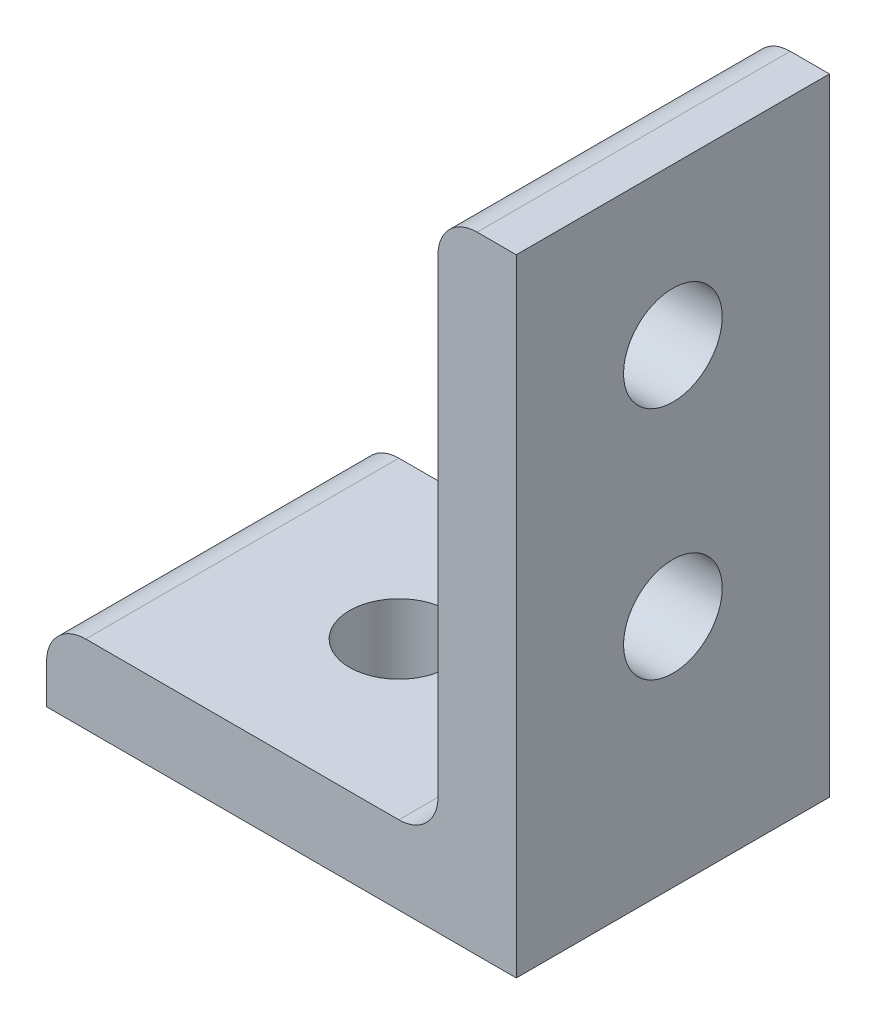
ISO-10303-21;
HEADER;
FILE_DESCRIPTION(('STEP AP214'),'2;1');
FILE_NAME('part.step','',(''),(''),'','','');
FILE_SCHEMA(('AUTOMOTIVE_DESIGN { 1 0 10303 214 1 1 1 1 }'));
ENDSEC;
DATA;
#1=APPLICATION_CONTEXT('core data for automotive mechanical design processes');
#2=APPLICATION_PROTOCOL_DEFINITION('international standard','automotive_design',2000,#1);
#3=PRODUCT_CONTEXT('',#1,'mechanical');
#4=PRODUCT('Part','Part','',(#3));
#5=PRODUCT_RELATED_PRODUCT_CATEGORY('part','',(#4));
#6=PRODUCT_DEFINITION_FORMATION('','',#4);
#7=PRODUCT_DEFINITION_CONTEXT('part definition',#1,'design');
#8=PRODUCT_DEFINITION('design','',#6,#7);
#9=PRODUCT_DEFINITION_SHAPE('','',#8);
#10=(LENGTH_UNIT() NAMED_UNIT(*) SI_UNIT(.MILLI.,.METRE.));
#11=(NAMED_UNIT(*) PLANE_ANGLE_UNIT() SI_UNIT($,.RADIAN.));
#12=(NAMED_UNIT(*) SI_UNIT($,.STERADIAN.) SOLID_ANGLE_UNIT());
#13=UNCERTAINTY_MEASURE_WITH_UNIT(LENGTH_MEASURE(1.E-05),#10,'distance_accuracy_value','');
#14=(GEOMETRIC_REPRESENTATION_CONTEXT(3) GLOBAL_UNCERTAINTY_ASSIGNED_CONTEXT((#13)) GLOBAL_UNIT_ASSIGNED_CONTEXT((#10,
#11,#12)) REPRESENTATION_CONTEXT('',''));
#15=CARTESIAN_POINT('',(0.,0.,0.));
#16=DIRECTION('',(0.,0.,1.));
#17=DIRECTION('',(1.,0.,0.));
#18=AXIS2_PLACEMENT_3D('',#15,#16,#17);
#19=CARTESIAN_POINT('',(-19.05,3.175,12.7));
#20=DIRECTION('',(1.,0.,0.));
#21=DIRECTION('',(0.,0.,-1.));
#22=AXIS2_PLACEMENT_3D('',#19,#20,#21);
#23=PLANE('',#22);
#24=DIRECTION('',(0.,-1.,0.));
#25=VECTOR('',#24,1.);
#26=CARTESIAN_POINT('',(-19.05,3.175,-12.7));
#27=LINE('',#26,#25);
#28=CARTESIAN_POINT('',(-19.05,3.175,-12.7));
#29=VERTEX_POINT('',#28);
#30=CARTESIAN_POINT('',(-19.05,0.,-12.7));
#31=VERTEX_POINT('',#30);
#32=EDGE_CURVE('E138',#29,#31,#27,.T.);
#33=ORIENTED_EDGE('',*,*,#32,.T.);
#34=DIRECTION('',(0.,0.,-1.));
#35=VECTOR('',#34,1.);
#36=CARTESIAN_POINT('',(-19.05,0.,12.7));
#37=LINE('',#36,#35);
#38=CARTESIAN_POINT('',(-19.05,0.,12.7));
#39=VERTEX_POINT('',#38);
#40=EDGE_CURVE('E11',#39,#31,#37,.T.);
#41=ORIENTED_EDGE('',*,*,#40,.F.);
#42=DIRECTION('',(0.,-1.,0.));
#43=VECTOR('',#42,1.);
#44=CARTESIAN_POINT('',(-19.05,3.175,12.7));
#45=LINE('',#44,#43);
#46=CARTESIAN_POINT('',(-19.05,3.175,12.7));
#47=VERTEX_POINT('',#46);
#48=EDGE_CURVE('E155',#47,#39,#45,.T.);
#49=ORIENTED_EDGE('',*,*,#48,.F.);
#50=DIRECTION('',(0.,0.,-1.));
#51=VECTOR('',#50,1.);
#52=CARTESIAN_POINT('',(-19.05,3.175,12.7));
#53=LINE('',#52,#51);
#54=EDGE_CURVE('E134',#47,#29,#53,.T.);
#55=ORIENTED_EDGE('',*,*,#54,.T.);
#56=EDGE_LOOP('',(#33,#41,#49,#55));
#57=FACE_BOUND('',#56,.T.);
#58=ADVANCED_FACE('F36',(#57),#23,.F.);
#59=CARTESIAN_POINT('',(-19.05,0.,12.7));
#60=DIRECTION('',(0.,1.,0.));
#61=DIRECTION('',(0.,0.,1.));
#62=AXIS2_PLACEMENT_3D('',#59,#60,#61);
#63=PLANE('',#62);
#64=CARTESIAN_POINT('',(-3.175,0.,0.));
#65=DIRECTION('',(0.,1.,0.));
#66=DIRECTION('',(-1.,0.,0.));
#67=AXIS2_PLACEMENT_3D('',#64,#65,#66);
#68=CIRCLE('',#67,4.);
#69=CARTESIAN_POINT('',(-7.175,0.,0.));
#70=VERTEX_POINT('',#69);
#71=EDGE_CURVE('E142',#70,#70,#68,.T.);
#72=ORIENTED_EDGE('',*,*,#71,.T.);
#73=EDGE_LOOP('',(#72));
#74=FACE_BOUND('',#73,.T.);
#75=DIRECTION('',(1.,0.,0.));
#76=VECTOR('',#75,1.);
#77=CARTESIAN_POINT('',(-19.05,0.,-12.7));
#78=LINE('',#77,#76);
#79=CARTESIAN_POINT('',(19.05,0.,-12.7));
#80=VERTEX_POINT('',#79);
#81=EDGE_CURVE('E141',#31,#80,#78,.T.);
#82=ORIENTED_EDGE('',*,*,#81,.T.);
#83=DIRECTION('',(0.,0.,-1.));
#84=VECTOR('',#83,1.);
#85=CARTESIAN_POINT('',(19.05,0.,12.7));
#86=LINE('',#85,#84);
#87=CARTESIAN_POINT('',(19.05,0.,12.7));
#88=VERTEX_POINT('',#87);
#89=EDGE_CURVE('E44',#88,#80,#86,.T.);
#90=ORIENTED_EDGE('',*,*,#89,.F.);
#91=DIRECTION('',(1.,0.,0.));
#92=VECTOR('',#91,1.);
#93=CARTESIAN_POINT('',(-19.05,0.,12.7));
#94=LINE('',#93,#92);
#95=EDGE_CURVE('E98',#39,#88,#94,.T.);
#96=ORIENTED_EDGE('',*,*,#95,.F.);
#97=ORIENTED_EDGE('',*,*,#40,.T.);
#98=EDGE_LOOP('',(#82,#90,#96,#97));
#99=FACE_BOUND('',#98,.T.);
#100=ADVANCED_FACE('F244',(#74,#99),#63,.F.);
#101=CARTESIAN_POINT('',(19.05,0.,12.7));
#102=DIRECTION('',(-1.,0.,0.));
#103=DIRECTION('',(0.,0.,1.));
#104=AXIS2_PLACEMENT_3D('',#101,#102,#103);
#105=PLANE('',#104);
#106=CARTESIAN_POINT('',(19.05,38.1,0.));
#107=DIRECTION('',(-1.,0.,0.));
#108=DIRECTION('',(0.,-1.,0.));
#109=AXIS2_PLACEMENT_3D('',#106,#107,#108);
#110=CIRCLE('',#109,4.);
#111=CARTESIAN_POINT('',(19.05,34.1,0.));
#112=VERTEX_POINT('',#111);
#113=EDGE_CURVE('E199',#112,#112,#110,.T.);
#114=ORIENTED_EDGE('',*,*,#113,.T.);
#115=EDGE_LOOP('',(#114));
#116=FACE_BOUND('',#115,.T.);
#117=CARTESIAN_POINT('',(19.05,19.05,0.));
#118=DIRECTION('',(-1.,0.,0.));
#119=DIRECTION('',(0.,1.,0.));
#120=AXIS2_PLACEMENT_3D('',#117,#118,#119);
#121=CIRCLE('',#120,4.);
#122=CARTESIAN_POINT('',(19.05,23.05,0.));
#123=VERTEX_POINT('',#122);
#124=EDGE_CURVE('E205',#123,#123,#121,.T.);
#125=ORIENTED_EDGE('',*,*,#124,.T.);
#126=EDGE_LOOP('',(#125));
#127=FACE_BOUND('',#126,.T.);
#128=DIRECTION('',(0.,1.,0.));
#129=VECTOR('',#128,1.);
#130=CARTESIAN_POINT('',(19.05,0.,-12.7));
#131=LINE('',#130,#129);
#132=CARTESIAN_POINT('',(19.05,50.8,-12.7));
#133=VERTEX_POINT('',#132);
#134=EDGE_CURVE('E144',#80,#133,#131,.T.);
#135=ORIENTED_EDGE('',*,*,#134,.T.);
#136=DIRECTION('',(0.,0.,-1.));
#137=VECTOR('',#136,1.);
#138=CARTESIAN_POINT('',(19.05,50.8,12.7));
#139=LINE('',#138,#137);
#140=CARTESIAN_POINT('',(19.05,50.8,12.7));
#141=VERTEX_POINT('',#140);
#142=EDGE_CURVE('E165',#141,#133,#139,.T.);
#143=ORIENTED_EDGE('',*,*,#142,.F.);
#144=DIRECTION('',(0.,1.,0.));
#145=VECTOR('',#144,1.);
#146=CARTESIAN_POINT('',(19.05,0.,12.7));
#147=LINE('',#146,#145);
#148=EDGE_CURVE('E173',#88,#141,#147,.T.);
#149=ORIENTED_EDGE('',*,*,#148,.F.);
#150=ORIENTED_EDGE('',*,*,#89,.T.);
#151=EDGE_LOOP('',(#135,#143,#149,#150));
#152=FACE_BOUND('',#151,.T.);
#153=ADVANCED_FACE('F171',(#116,#127,#152),#105,.F.);
#154=CARTESIAN_POINT('',(15.875,50.8,12.7));
#155=DIRECTION('',(0.,-1.,0.));
#156=DIRECTION('',(0.,0.,-1.));
#157=AXIS2_PLACEMENT_3D('',#154,#155,#156);
#158=PLANE('',#157);
#159=DIRECTION('',(-1.,0.,0.));
#160=VECTOR('',#159,1.);
#161=CARTESIAN_POINT('',(15.875,50.8,-12.7));
#162=LINE('',#161,#160);
#163=CARTESIAN_POINT('',(15.875,50.8,-12.7));
#164=VERTEX_POINT('',#163);
#165=EDGE_CURVE('E146',#133,#164,#162,.T.);
#166=ORIENTED_EDGE('',*,*,#165,.T.);
#167=DIRECTION('',(0.,0.,-1.));
#168=VECTOR('',#167,1.);
#169=CARTESIAN_POINT('',(15.875,50.8,12.7));
#170=LINE('',#169,#168);
#171=CARTESIAN_POINT('',(15.875,50.8,12.7));
#172=VERTEX_POINT('',#171);
#173=EDGE_CURVE('E162',#172,#164,#170,.T.);
#174=ORIENTED_EDGE('',*,*,#173,.F.);
#175=DIRECTION('',(-1.,0.,0.));
#176=VECTOR('',#175,1.);
#177=CARTESIAN_POINT('',(15.875,50.8,12.7));
#178=LINE('',#177,#176);
#179=EDGE_CURVE('E189',#141,#172,#178,.T.);
#180=ORIENTED_EDGE('',*,*,#179,.F.);
#181=ORIENTED_EDGE('',*,*,#142,.T.);
#182=EDGE_LOOP('',(#166,#174,#180,#181));
#183=FACE_BOUND('',#182,.T.);
#184=ADVANCED_FACE('F182',(#183),#158,.F.);
#185=CARTESIAN_POINT('',(15.875,47.625,12.7));
#186=DIRECTION('',(0.,0.,-1.));
#187=DIRECTION('',(-1.,0.,0.));
#188=AXIS2_PLACEMENT_3D('',#185,#186,#187);
#189=CYLINDRICAL_SURFACE('',#188,3.175);
#190=CARTESIAN_POINT('',(15.875,47.625,-12.7));
#191=DIRECTION('',(0.,0.,1.));
#192=DIRECTION('',(-1.,0.,0.));
#193=AXIS2_PLACEMENT_3D('',#190,#191,#192);
#194=CIRCLE('',#193,3.175);
#195=CARTESIAN_POINT('',(12.7,47.625,-12.7));
#196=VERTEX_POINT('',#195);
#197=EDGE_CURVE('E148',#164,#196,#194,.T.);
#198=ORIENTED_EDGE('',*,*,#197,.T.);
#199=DIRECTION('',(0.,0.,-1.));
#200=VECTOR('',#199,1.);
#201=CARTESIAN_POINT('',(12.7,47.625,12.7));
#202=LINE('',#201,#200);
#203=CARTESIAN_POINT('',(12.7,47.625,12.7));
#204=VERTEX_POINT('',#203);
#205=EDGE_CURVE('E159',#204,#196,#202,.T.);
#206=ORIENTED_EDGE('',*,*,#205,.F.);
#207=CARTESIAN_POINT('',(15.875,47.625,12.7));
#208=DIRECTION('',(0.,0.,1.));
#209=DIRECTION('',(-1.,0.,0.));
#210=AXIS2_PLACEMENT_3D('',#207,#208,#209);
#211=CIRCLE('',#210,3.175);
#212=EDGE_CURVE('E188',#172,#204,#211,.T.);
#213=ORIENTED_EDGE('',*,*,#212,.F.);
#214=ORIENTED_EDGE('',*,*,#173,.T.);
#215=EDGE_LOOP('',(#198,#206,#213,#214));
#216=FACE_BOUND('',#215,.T.);
#217=ADVANCED_FACE('F186',(#216),#189,.T.);
#218=CARTESIAN_POINT('',(12.7,47.625,12.7));
#219=DIRECTION('',(1.,0.,0.));
#220=DIRECTION('',(0.,1.,0.));
#221=AXIS2_PLACEMENT_3D('',#218,#219,#220);
#222=PLANE('',#221);
#223=CARTESIAN_POINT('',(12.7,38.1,0.));
#224=DIRECTION('',(-1.,0.,0.));
#225=DIRECTION('',(0.,-1.,0.));
#226=AXIS2_PLACEMENT_3D('',#223,#224,#225);
#227=CIRCLE('',#226,4.);
#228=CARTESIAN_POINT('',(12.7,34.1,0.));
#229=VERTEX_POINT('',#228);
#230=EDGE_CURVE('E208',#229,#229,#227,.T.);
#231=ORIENTED_EDGE('',*,*,#230,.F.);
#232=EDGE_LOOP('',(#231));
#233=FACE_BOUND('',#232,.T.);
#234=CARTESIAN_POINT('',(12.7,19.05,0.));
#235=DIRECTION('',(-1.,0.,0.));
#236=DIRECTION('',(0.,1.,0.));
#237=AXIS2_PLACEMENT_3D('',#234,#235,#236);
#238=CIRCLE('',#237,4.);
#239=CARTESIAN_POINT('',(12.7,23.05,0.));
#240=VERTEX_POINT('',#239);
#241=EDGE_CURVE('E202',#240,#240,#238,.T.);
#242=ORIENTED_EDGE('',*,*,#241,.F.);
#243=EDGE_LOOP('',(#242));
#244=FACE_BOUND('',#243,.T.);
#245=DIRECTION('',(0.,-1.,0.));
#246=VECTOR('',#245,1.);
#247=CARTESIAN_POINT('',(12.7,47.625,-12.7));
#248=LINE('',#247,#246);
#249=CARTESIAN_POINT('',(12.7,9.525,-12.7));
#250=VERTEX_POINT('',#249);
#251=EDGE_CURVE('E150',#196,#250,#248,.T.);
#252=ORIENTED_EDGE('',*,*,#251,.T.);
#253=DIRECTION('',(0.,0.,-1.));
#254=VECTOR('',#253,1.);
#255=CARTESIAN_POINT('',(12.7,9.525,12.7));
#256=LINE('',#255,#254);
#257=CARTESIAN_POINT('',(12.7,9.525,12.7));
#258=VERTEX_POINT('',#257);
#259=EDGE_CURVE('E129',#258,#250,#256,.T.);
#260=ORIENTED_EDGE('',*,*,#259,.F.);
#261=DIRECTION('',(0.,-1.,0.));
#262=VECTOR('',#261,1.);
#263=CARTESIAN_POINT('',(12.7,47.625,12.7));
#264=LINE('',#263,#262);
#265=EDGE_CURVE('E120',#204,#258,#264,.T.);
#266=ORIENTED_EDGE('',*,*,#265,.F.);
#267=ORIENTED_EDGE('',*,*,#205,.T.);
#268=EDGE_LOOP('',(#252,#260,#266,#267));
#269=FACE_BOUND('',#268,.T.);
#270=ADVANCED_FACE('F223',(#233,#244,#269),#222,.F.);
#271=CARTESIAN_POINT('',(9.52500000000001,9.525,12.7));
#272=DIRECTION('',(0.,0.,-1.));
#273=DIRECTION('',(-1.,0.,0.));
#274=AXIS2_PLACEMENT_3D('',#271,#272,#273);
#275=CYLINDRICAL_SURFACE('',#274,3.175);
#276=CARTESIAN_POINT('',(9.52500000000001,9.525,-12.7));
#277=DIRECTION('',(0.,0.,-1.));
#278=DIRECTION('',(-1.,0.,0.));
#279=AXIS2_PLACEMENT_3D('',#276,#277,#278);
#280=CIRCLE('',#279,3.175);
#281=CARTESIAN_POINT('',(9.52500000000001,6.35,-12.7));
#282=VERTEX_POINT('',#281);
#283=EDGE_CURVE('E128',#250,#282,#280,.T.);
#284=ORIENTED_EDGE('',*,*,#283,.T.);
#285=DIRECTION('',(0.,0.,-1.));
#286=VECTOR('',#285,1.);
#287=CARTESIAN_POINT('',(9.52500000000001,6.35,12.7));
#288=LINE('',#287,#286);
#289=CARTESIAN_POINT('',(9.52500000000001,6.35,12.7));
#290=VERTEX_POINT('',#289);
#291=EDGE_CURVE('E125',#290,#282,#288,.T.);
#292=ORIENTED_EDGE('',*,*,#291,.F.);
#293=CARTESIAN_POINT('',(9.52500000000001,9.525,12.7));
#294=DIRECTION('',(0.,0.,-1.));
#295=DIRECTION('',(-1.,0.,0.));
#296=AXIS2_PLACEMENT_3D('',#293,#294,#295);
#297=CIRCLE('',#296,3.175);
#298=EDGE_CURVE('E114',#258,#290,#297,.T.);
#299=ORIENTED_EDGE('',*,*,#298,.F.);
#300=ORIENTED_EDGE('',*,*,#259,.T.);
#301=EDGE_LOOP('',(#284,#292,#299,#300));
#302=FACE_BOUND('',#301,.T.);
#303=ADVANCED_FACE('F126',(#302),#275,.F.);
#304=CARTESIAN_POINT('',(9.52500000000001,6.35,12.7));
#305=DIRECTION('',(0.,-1.,0.));
#306=DIRECTION('',(1.,0.,0.));
#307=AXIS2_PLACEMENT_3D('',#304,#305,#306);
#308=PLANE('',#307);
#309=CARTESIAN_POINT('',(-3.175,6.35,0.));
#310=DIRECTION('',(0.,1.,0.));
#311=DIRECTION('',(-1.,0.,0.));
#312=AXIS2_PLACEMENT_3D('',#309,#310,#311);
#313=CIRCLE('',#312,4.);
#314=CARTESIAN_POINT('',(-7.175,6.35,0.));
#315=VERTEX_POINT('',#314);
#316=EDGE_CURVE('E196',#315,#315,#313,.T.);
#317=ORIENTED_EDGE('',*,*,#316,.F.);
#318=EDGE_LOOP('',(#317));
#319=FACE_BOUND('',#318,.T.);
#320=DIRECTION('',(-1.,0.,0.));
#321=VECTOR('',#320,1.);
#322=CARTESIAN_POINT('',(9.52500000000001,6.35,-12.7));
#323=LINE('',#322,#321);
#324=CARTESIAN_POINT('',(-15.875,6.35,-12.7));
#325=VERTEX_POINT('',#324);
#326=EDGE_CURVE('E84',#282,#325,#323,.T.);
#327=ORIENTED_EDGE('',*,*,#326,.T.);
#328=DIRECTION('',(0.,0.,-1.));
#329=VECTOR('',#328,1.);
#330=CARTESIAN_POINT('',(-15.875,6.35,12.7));
#331=LINE('',#330,#329);
#332=CARTESIAN_POINT('',(-15.875,6.35,12.7));
#333=VERTEX_POINT('',#332);
#334=EDGE_CURVE('E130',#333,#325,#331,.T.);
#335=ORIENTED_EDGE('',*,*,#334,.F.);
#336=DIRECTION('',(-1.,0.,0.));
#337=VECTOR('',#336,1.);
#338=CARTESIAN_POINT('',(9.52500000000001,6.35,12.7));
#339=LINE('',#338,#337);
#340=EDGE_CURVE('E118',#290,#333,#339,.T.);
#341=ORIENTED_EDGE('',*,*,#340,.F.);
#342=ORIENTED_EDGE('',*,*,#291,.T.);
#343=EDGE_LOOP('',(#327,#335,#341,#342));
#344=FACE_BOUND('',#343,.T.);
#345=ADVANCED_FACE('F132',(#319,#344),#308,.F.);
#346=CARTESIAN_POINT('',(-15.875,3.175,12.7));
#347=DIRECTION('',(0.,0.,-1.));
#348=DIRECTION('',(-1.,0.,0.));
#349=AXIS2_PLACEMENT_3D('',#346,#347,#348);
#350=CYLINDRICAL_SURFACE('',#349,3.175);
#351=CARTESIAN_POINT('',(-15.875,3.175,-12.7));
#352=DIRECTION('',(0.,0.,1.));
#353=DIRECTION('',(-1.,0.,0.));
#354=AXIS2_PLACEMENT_3D('',#351,#352,#353);
#355=CIRCLE('',#354,3.175);
#356=EDGE_CURVE('E90',#325,#29,#355,.T.);
#357=ORIENTED_EDGE('',*,*,#356,.T.);
#358=ORIENTED_EDGE('',*,*,#54,.F.);
#359=CARTESIAN_POINT('',(-15.875,3.175,12.7));
#360=DIRECTION('',(0.,0.,1.));
#361=DIRECTION('',(-1.,0.,0.));
#362=AXIS2_PLACEMENT_3D('',#359,#360,#361);
#363=CIRCLE('',#362,3.175);
#364=EDGE_CURVE('E52',#333,#47,#363,.T.);
#365=ORIENTED_EDGE('',*,*,#364,.F.);
#366=ORIENTED_EDGE('',*,*,#334,.T.);
#367=EDGE_LOOP('',(#357,#358,#365,#366));
#368=FACE_BOUND('',#367,.T.);
#369=ADVANCED_FACE('F232',(#368),#350,.T.);
#370=CARTESIAN_POINT('',(15.875,47.625,12.7));
#371=DIRECTION('',(0.,0.,-1.));
#372=DIRECTION('',(-1.,0.,0.));
#373=AXIS2_PLACEMENT_3D('',#370,#371,#372);
#374=PLANE('',#373);
#375=ORIENTED_EDGE('',*,*,#48,.T.);
#376=ORIENTED_EDGE('',*,*,#95,.T.);
#377=ORIENTED_EDGE('',*,*,#148,.T.);
#378=ORIENTED_EDGE('',*,*,#179,.T.);
#379=ORIENTED_EDGE('',*,*,#212,.T.);
#380=ORIENTED_EDGE('',*,*,#265,.T.);
#381=ORIENTED_EDGE('',*,*,#298,.T.);
#382=ORIENTED_EDGE('',*,*,#340,.T.);
#383=ORIENTED_EDGE('',*,*,#364,.T.);
#384=EDGE_LOOP('',(#375,#376,#377,#378,#379,#380,#381,#382,#383));
#385=FACE_BOUND('',#384,.T.);
#386=ADVANCED_FACE('F116',(#385),#374,.F.);
#387=CARTESIAN_POINT('',(15.875,47.625,-12.7));
#388=DIRECTION('',(0.,0.,-1.));
#389=DIRECTION('',(-1.,0.,0.));
#390=AXIS2_PLACEMENT_3D('',#387,#388,#389);
#391=PLANE('',#390);
#392=ORIENTED_EDGE('',*,*,#32,.F.);
#393=ORIENTED_EDGE('',*,*,#356,.F.);
#394=ORIENTED_EDGE('',*,*,#326,.F.);
#395=ORIENTED_EDGE('',*,*,#283,.F.);
#396=ORIENTED_EDGE('',*,*,#251,.F.);
#397=ORIENTED_EDGE('',*,*,#197,.F.);
#398=ORIENTED_EDGE('',*,*,#165,.F.);
#399=ORIENTED_EDGE('',*,*,#134,.F.);
#400=ORIENTED_EDGE('',*,*,#81,.F.);
#401=EDGE_LOOP('',(#392,#393,#394,#395,#396,#397,#398,#399,#400));
#402=FACE_BOUND('',#401,.T.);
#403=ADVANCED_FACE('F177',(#402),#391,.T.);
#404=CARTESIAN_POINT('',(-3.175,0.,0.));
#405=DIRECTION('',(0.,1.,0.));
#406=DIRECTION('',(-1.,0.,0.));
#407=AXIS2_PLACEMENT_3D('',#404,#405,#406);
#408=CYLINDRICAL_SURFACE('',#407,4.);
#409=CARTESIAN_POINT('',(-7.175,0.,0.));
#410=CARTESIAN_POINT('',(-7.175,0.0661458333333313,0.));
#411=CARTESIAN_POINT('',(-7.175,0.132291666666665,0.));
#412=CARTESIAN_POINT('',(-7.175,0.264583333333331,0.));
#413=CARTESIAN_POINT('',(-7.175,0.330729166666665,0.));
#414=CARTESIAN_POINT('',(-7.175,0.463020833333331,0.));
#415=CARTESIAN_POINT('',(-7.175,0.529166666666665,0.));
#416=CARTESIAN_POINT('',(-7.175,0.661458333333331,0.));
#417=CARTESIAN_POINT('',(-7.175,0.727604166666665,0.));
#418=CARTESIAN_POINT('',(-7.175,0.859895833333331,0.));
#419=CARTESIAN_POINT('',(-7.175,0.926041666666665,0.));
#420=CARTESIAN_POINT('',(-7.175,1.05833333333333,0.));
#421=CARTESIAN_POINT('',(-7.175,1.12447916666666,0.));
#422=CARTESIAN_POINT('',(-7.175,1.25677083333333,0.));
#423=CARTESIAN_POINT('',(-7.175,1.32291666666666,0.));
#424=CARTESIAN_POINT('',(-7.175,1.45520833333333,0.));
#425=CARTESIAN_POINT('',(-7.175,1.52135416666666,0.));
#426=CARTESIAN_POINT('',(-7.175,1.65364583333333,0.));
#427=CARTESIAN_POINT('',(-7.175,1.71979166666666,0.));
#428=CARTESIAN_POINT('',(-7.175,1.85208333333333,0.));
#429=CARTESIAN_POINT('',(-7.175,1.91822916666666,0.));
#430=CARTESIAN_POINT('',(-7.175,2.05052083333333,0.));
#431=CARTESIAN_POINT('',(-7.175,2.11666666666666,0.));
#432=CARTESIAN_POINT('',(-7.175,2.24895833333333,0.));
#433=CARTESIAN_POINT('',(-7.175,2.31510416666666,0.));
#434=CARTESIAN_POINT('',(-7.175,2.44739583333333,0.));
#435=CARTESIAN_POINT('',(-7.175,2.51354166666666,0.));
#436=CARTESIAN_POINT('',(-7.175,2.64583333333333,0.));
#437=CARTESIAN_POINT('',(-7.175,2.71197916666666,0.));
#438=CARTESIAN_POINT('',(-7.175,2.84427083333333,0.));
#439=CARTESIAN_POINT('',(-7.175,2.91041666666667,0.));
#440=CARTESIAN_POINT('',(-7.175,3.04270833333333,0.));
#441=CARTESIAN_POINT('',(-7.175,3.10885416666666,0.));
#442=CARTESIAN_POINT('',(-7.175,3.24114583333333,0.));
#443=CARTESIAN_POINT('',(-7.175,3.30729166666666,0.));
#444=CARTESIAN_POINT('',(-7.175,3.43958333333333,0.));
#445=CARTESIAN_POINT('',(-7.175,3.50572916666667,0.));
#446=CARTESIAN_POINT('',(-7.175,3.63802083333333,0.));
#447=CARTESIAN_POINT('',(-7.175,3.70416666666667,0.));
#448=CARTESIAN_POINT('',(-7.175,3.83645833333333,0.));
#449=CARTESIAN_POINT('',(-7.175,3.90260416666667,0.));
#450=CARTESIAN_POINT('',(-7.175,4.03489583333333,0.));
#451=CARTESIAN_POINT('',(-7.175,4.10104166666667,0.));
#452=CARTESIAN_POINT('',(-7.175,4.23333333333333,0.));
#453=CARTESIAN_POINT('',(-7.175,4.29947916666667,0.));
#454=CARTESIAN_POINT('',(-7.175,4.43177083333333,0.));
#455=CARTESIAN_POINT('',(-7.175,4.49791666666667,0.));
#456=CARTESIAN_POINT('',(-7.175,4.63020833333333,0.));
#457=CARTESIAN_POINT('',(-7.175,4.69635416666667,0.));
#458=CARTESIAN_POINT('',(-7.175,4.82864583333333,0.));
#459=CARTESIAN_POINT('',(-7.175,4.89479166666667,0.));
#460=CARTESIAN_POINT('',(-7.175,5.02708333333333,0.));
#461=CARTESIAN_POINT('',(-7.175,5.09322916666667,0.));
#462=CARTESIAN_POINT('',(-7.175,5.22552083333333,0.));
#463=CARTESIAN_POINT('',(-7.175,5.29166666666667,0.));
#464=CARTESIAN_POINT('',(-7.175,5.42395833333333,0.));
#465=CARTESIAN_POINT('',(-7.175,5.49010416666667,0.));
#466=CARTESIAN_POINT('',(-7.175,5.62239583333333,0.));
#467=CARTESIAN_POINT('',(-7.175,5.68854166666667,0.));
#468=CARTESIAN_POINT('',(-7.175,5.82083333333333,0.));
#469=CARTESIAN_POINT('',(-7.175,5.88697916666667,0.));
#470=CARTESIAN_POINT('',(-7.175,6.01927083333333,0.));
#471=CARTESIAN_POINT('',(-7.175,6.08541666666667,0.));
#472=CARTESIAN_POINT('',(-7.175,6.21770833333333,0.));
#473=CARTESIAN_POINT('',(-7.175,6.28385416666667,0.));
#474=CARTESIAN_POINT('',(-7.175,6.35,0.));
#475=B_SPLINE_CURVE_WITH_KNOTS('',3,(#409,#410,#411,#412,#413,#414,#415,#416,#417,#418,#419,
#420,#421,#422,#423,#424,#425,#426,#427,#428,#429,#430,#431,#432,#433,#434,#435,#436,#437,#438,
#439,#440,#441,#442,#443,#444,#445,#446,#447,#448,#449,#450,#451,#452,#453,#454,#455,#456,#457,
#458,#459,#460,#461,#462,#463,#464,#465,#466,#467,#468,#469,#470,#471,#472,#473,#474),
.UNSPECIFIED.,.F.,.F.,(4,2,2,2,2,2,2,2,2,2,2,2,2,2,2,2,2,2,2,2,2,2,2,2,2,2,2,2,2,2,2,2,4),(0.,
0.1984375,0.396875,0.5953125,0.79375,0.9921875,1.190625,1.3890625,1.5875,1.7859375,1.984375,
2.1828125,2.38125,2.5796875,2.778125,2.9765625,3.175,3.3734375,3.571875,3.7703125,3.96875,
4.1671875,4.365625,4.5640625,4.7625,4.9609375,5.159375,5.3578125,5.55625,5.7546875,5.953125,
6.1515625,6.35),.UNSPECIFIED.);
#476=EDGE_CURVE('BSEAM277',#70,#315,#475,.T.);
#477=ORIENTED_EDGE('',*,*,#71,.F.);
#478=ORIENTED_EDGE('',*,*,#316,.T.);
#479=ORIENTED_EDGE('',*,*,#476,.T.);
#480=ORIENTED_EDGE('',*,*,#476,.F.);
#481=EDGE_LOOP('',(#477,#479,#478,#480));
#482=FACE_BOUND('',#481,.T.);
#483=ADVANCED_FACE('F277',(#482),#408,.F.);
#484=CARTESIAN_POINT('',(19.05,19.05,0.));
#485=DIRECTION('',(-1.,0.,0.));
#486=DIRECTION('',(0.,-1.,0.));
#487=AXIS2_PLACEMENT_3D('',#484,#485,#486);
#488=CYLINDRICAL_SURFACE('',#487,4.);
#489=ORIENTED_EDGE('',*,*,#124,.F.);
#490=EDGE_LOOP('',(#489));
#491=FACE_BOUND('',#490,.T.);
#492=ORIENTED_EDGE('',*,*,#241,.T.);
#493=EDGE_LOOP('',(#492));
#494=FACE_BOUND('',#493,.T.);
#495=ADVANCED_FACE('F219',(#491,#494),#488,.F.);
#496=CARTESIAN_POINT('',(19.05,38.1,0.));
#497=DIRECTION('',(-1.,0.,0.));
#498=DIRECTION('',(0.,-1.,0.));
#499=AXIS2_PLACEMENT_3D('',#496,#497,#498);
#500=CYLINDRICAL_SURFACE('',#499,4.);
#501=ORIENTED_EDGE('',*,*,#113,.F.);
#502=EDGE_LOOP('',(#501));
#503=FACE_BOUND('',#502,.T.);
#504=ORIENTED_EDGE('',*,*,#230,.T.);
#505=EDGE_LOOP('',(#504));
#506=FACE_BOUND('',#505,.T.);
#507=ADVANCED_FACE('F216',(#503,#506),#500,.F.);
#508=CLOSED_SHELL('',(#58,#100,#153,#184,#217,#270,#303,#345,#369,#386,#403,#483,#495,#507));
#509=MANIFOLD_SOLID_BREP('B2',#508);
#510=ADVANCED_BREP_SHAPE_REPRESENTATION('',(#18,#509),#14);
#511=SHAPE_DEFINITION_REPRESENTATION(#9,#510);
ENDSEC;
END-ISO-10303-21;
